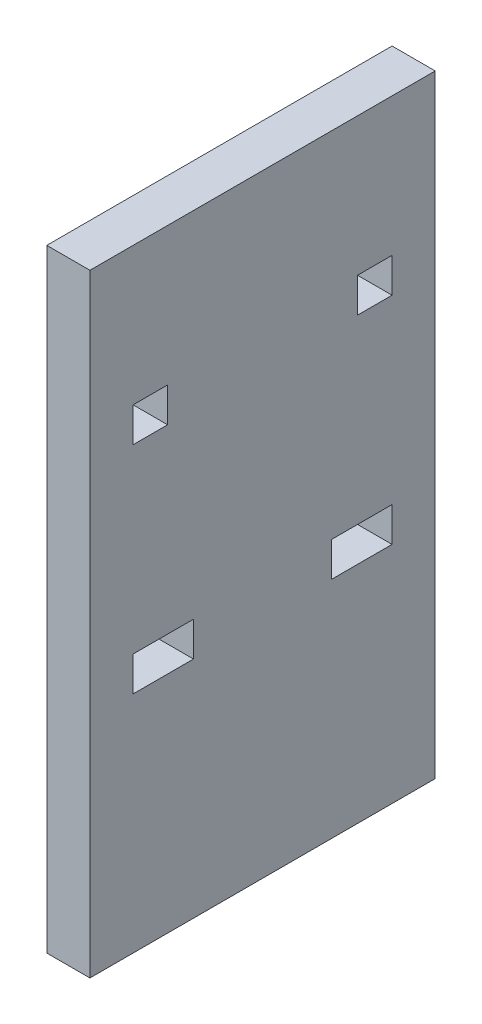
ISO-10303-21;
HEADER;
FILE_DESCRIPTION(('STEP AP214'),'2;1');
FILE_NAME('part.step','',(''),(''),'','','');
FILE_SCHEMA(('AUTOMOTIVE_DESIGN { 1 0 10303 214 1 1 1 1 }'));
ENDSEC;
DATA;
#1=APPLICATION_CONTEXT('core data for automotive mechanical design processes');
#2=APPLICATION_PROTOCOL_DEFINITION('international standard','automotive_design',2000,#1);
#3=PRODUCT_CONTEXT('',#1,'mechanical');
#4=PRODUCT('Part','Part','',(#3));
#5=PRODUCT_RELATED_PRODUCT_CATEGORY('part','',(#4));
#6=PRODUCT_DEFINITION_FORMATION('','',#4);
#7=PRODUCT_DEFINITION_CONTEXT('part definition',#1,'design');
#8=PRODUCT_DEFINITION('design','',#6,#7);
#9=PRODUCT_DEFINITION_SHAPE('','',#8);
#10=(LENGTH_UNIT() NAMED_UNIT(*) SI_UNIT(.MILLI.,.METRE.));
#11=(NAMED_UNIT(*) PLANE_ANGLE_UNIT() SI_UNIT($,.RADIAN.));
#12=(NAMED_UNIT(*) SI_UNIT($,.STERADIAN.) SOLID_ANGLE_UNIT());
#13=UNCERTAINTY_MEASURE_WITH_UNIT(LENGTH_MEASURE(1.E-05),#10,'distance_accuracy_value','');
#14=(GEOMETRIC_REPRESENTATION_CONTEXT(3) GLOBAL_UNCERTAINTY_ASSIGNED_CONTEXT((#13)) GLOBAL_UNIT_ASSIGNED_CONTEXT((#10,
#11,#12)) REPRESENTATION_CONTEXT('',''));
#15=CARTESIAN_POINT('',(0.,0.,0.));
#16=DIRECTION('',(0.,0.,1.));
#17=DIRECTION('',(1.,0.,0.));
#18=AXIS2_PLACEMENT_3D('',#15,#16,#17);
#19=CARTESIAN_POINT('',(2.5,71.,-20.));
#20=DIRECTION('',(-1.,0.,0.));
#21=DIRECTION('',(0.,0.,1.));
#22=AXIS2_PLACEMENT_3D('',#19,#20,#21);
#23=PLANE('',#22);
#24=DIRECTION('',(0.,0.,1.));
#25=VECTOR('',#24,1.);
#26=CARTESIAN_POINT('',(2.5,30.,-15.));
#27=LINE('',#26,#25);
#28=CARTESIAN_POINT('',(2.5,30.,-15.));
#29=VERTEX_POINT('',#28);
#30=CARTESIAN_POINT('',(2.5,30.,-8.));
#31=VERTEX_POINT('',#30);
#32=EDGE_CURVE('E390',#29,#31,#27,.T.);
#33=ORIENTED_EDGE('',*,*,#32,.F.);
#34=DIRECTION('',(0.,1.,0.));
#35=VECTOR('',#34,1.);
#36=CARTESIAN_POINT('',(2.5,30.,-15.));
#37=LINE('',#36,#35);
#38=CARTESIAN_POINT('',(2.5,26.,-15.));
#39=VERTEX_POINT('',#38);
#40=EDGE_CURVE('E53',#39,#29,#37,.T.);
#41=ORIENTED_EDGE('',*,*,#40,.F.);
#42=DIRECTION('',(0.,0.,-1.));
#43=VECTOR('',#42,1.);
#44=CARTESIAN_POINT('',(2.5,26.,-15.));
#45=LINE('',#44,#43);
#46=CARTESIAN_POINT('',(2.5,26.,-8.));
#47=VERTEX_POINT('',#46);
#48=EDGE_CURVE('E328',#47,#39,#45,.T.);
#49=ORIENTED_EDGE('',*,*,#48,.F.);
#50=DIRECTION('',(0.,-1.,0.));
#51=VECTOR('',#50,1.);
#52=CARTESIAN_POINT('',(2.5,30.,-8.));
#53=LINE('',#52,#51);
#54=EDGE_CURVE('E318',#31,#47,#53,.T.);
#55=ORIENTED_EDGE('',*,*,#54,.F.);
#56=EDGE_LOOP('',(#33,#41,#49,#55));
#57=FACE_BOUND('',#56,.T.);
#58=DIRECTION('',(0.,0.,1.));
#59=VECTOR('',#58,1.);
#60=CARTESIAN_POINT('',(2.5,55.,15.));
#61=LINE('',#60,#59);
#62=CARTESIAN_POINT('',(2.5,55.,11.));
#63=VERTEX_POINT('',#62);
#64=CARTESIAN_POINT('',(2.5,55.,15.));
#65=VERTEX_POINT('',#64);
#66=EDGE_CURVE('E331',#63,#65,#61,.T.);
#67=ORIENTED_EDGE('',*,*,#66,.F.);
#68=DIRECTION('',(0.,1.,0.));
#69=VECTOR('',#68,1.);
#70=CARTESIAN_POINT('',(2.5,55.,11.));
#71=LINE('',#70,#69);
#72=CARTESIAN_POINT('',(2.5,51.,11.));
#73=VERTEX_POINT('',#72);
#74=EDGE_CURVE('E61',#73,#63,#71,.T.);
#75=ORIENTED_EDGE('',*,*,#74,.F.);
#76=DIRECTION('',(0.,0.,-1.));
#77=VECTOR('',#76,1.);
#78=CARTESIAN_POINT('',(2.5,51.,15.));
#79=LINE('',#78,#77);
#80=CARTESIAN_POINT('',(2.5,51.,15.));
#81=VERTEX_POINT('',#80);
#82=EDGE_CURVE('E342',#81,#73,#79,.T.);
#83=ORIENTED_EDGE('',*,*,#82,.F.);
#84=DIRECTION('',(0.,-1.,0.));
#85=VECTOR('',#84,1.);
#86=CARTESIAN_POINT('',(2.5,55.,15.));
#87=LINE('',#86,#85);
#88=EDGE_CURVE('E347',#65,#81,#87,.T.);
#89=ORIENTED_EDGE('',*,*,#88,.F.);
#90=EDGE_LOOP('',(#67,#75,#83,#89));
#91=FACE_BOUND('',#90,.T.);
#92=DIRECTION('',(0.,0.,1.));
#93=VECTOR('',#92,1.);
#94=CARTESIAN_POINT('',(2.5,55.,-15.));
#95=LINE('',#94,#93);
#96=CARTESIAN_POINT('',(2.5,55.,-15.));
#97=VERTEX_POINT('',#96);
#98=CARTESIAN_POINT('',(2.5,55.,-11.));
#99=VERTEX_POINT('',#98);
#100=EDGE_CURVE('E193',#97,#99,#95,.T.);
#101=ORIENTED_EDGE('',*,*,#100,.F.);
#102=DIRECTION('',(0.,1.,0.));
#103=VECTOR('',#102,1.);
#104=CARTESIAN_POINT('',(2.5,55.,-15.));
#105=LINE('',#104,#103);
#106=CARTESIAN_POINT('',(2.5,51.,-15.));
#107=VERTEX_POINT('',#106);
#108=EDGE_CURVE('E198',#107,#97,#105,.T.);
#109=ORIENTED_EDGE('',*,*,#108,.F.);
#110=DIRECTION('',(0.,0.,-1.));
#111=VECTOR('',#110,1.);
#112=CARTESIAN_POINT('',(2.5,51.,-15.));
#113=LINE('',#112,#111);
#114=CARTESIAN_POINT('',(2.5,51.,-11.));
#115=VERTEX_POINT('',#114);
#116=EDGE_CURVE('E202',#115,#107,#113,.T.);
#117=ORIENTED_EDGE('',*,*,#116,.F.);
#118=DIRECTION('',(0.,-1.,0.));
#119=VECTOR('',#118,1.);
#120=CARTESIAN_POINT('',(2.5,55.,-11.));
#121=LINE('',#120,#119);
#122=EDGE_CURVE('E182',#99,#115,#121,.T.);
#123=ORIENTED_EDGE('',*,*,#122,.F.);
#124=EDGE_LOOP('',(#101,#109,#117,#123));
#125=FACE_BOUND('',#124,.T.);
#126=DIRECTION('',(0.,0.,1.));
#127=VECTOR('',#126,1.);
#128=CARTESIAN_POINT('',(2.5,30.,15.));
#129=LINE('',#128,#127);
#130=CARTESIAN_POINT('',(2.5,30.,8.));
#131=VERTEX_POINT('',#130);
#132=CARTESIAN_POINT('',(2.5,30.,15.));
#133=VERTEX_POINT('',#132);
#134=EDGE_CURVE('E218',#131,#133,#129,.T.);
#135=ORIENTED_EDGE('',*,*,#134,.F.);
#136=DIRECTION('',(0.,1.,0.));
#137=VECTOR('',#136,1.);
#138=CARTESIAN_POINT('',(2.5,30.,8.));
#139=LINE('',#138,#137);
#140=CARTESIAN_POINT('',(2.5,26.,8.));
#141=VERTEX_POINT('',#140);
#142=EDGE_CURVE('E223',#141,#131,#139,.T.);
#143=ORIENTED_EDGE('',*,*,#142,.F.);
#144=DIRECTION('',(0.,0.,-1.));
#145=VECTOR('',#144,1.);
#146=CARTESIAN_POINT('',(2.5,26.,15.));
#147=LINE('',#146,#145);
#148=CARTESIAN_POINT('',(2.5,26.,15.));
#149=VERTEX_POINT('',#148);
#150=EDGE_CURVE('E229',#149,#141,#147,.T.);
#151=ORIENTED_EDGE('',*,*,#150,.F.);
#152=DIRECTION('',(0.,-1.,0.));
#153=VECTOR('',#152,1.);
#154=CARTESIAN_POINT('',(2.5,30.,15.));
#155=LINE('',#154,#153);
#156=EDGE_CURVE('E222',#133,#149,#155,.T.);
#157=ORIENTED_EDGE('',*,*,#156,.F.);
#158=EDGE_LOOP('',(#135,#143,#151,#157));
#159=FACE_BOUND('',#158,.T.);
#160=DIRECTION('',(0.,0.,-1.));
#161=VECTOR('',#160,1.);
#162=CARTESIAN_POINT('',(2.5,0.,-20.));
#163=LINE('',#162,#161);
#164=CARTESIAN_POINT('',(2.5,0.,20.));
#165=VERTEX_POINT('',#164);
#166=CARTESIAN_POINT('',(2.5,0.,-20.));
#167=VERTEX_POINT('',#166);
#168=EDGE_CURVE('E237',#165,#167,#163,.T.);
#169=ORIENTED_EDGE('',*,*,#168,.T.);
#170=DIRECTION('',(0.,-1.,0.));
#171=VECTOR('',#170,1.);
#172=CARTESIAN_POINT('',(2.5,71.,-20.));
#173=LINE('',#172,#171);
#174=CARTESIAN_POINT('',(2.5,71.,-20.));
#175=VERTEX_POINT('',#174);
#176=EDGE_CURVE('E260',#175,#167,#173,.T.);
#177=ORIENTED_EDGE('',*,*,#176,.F.);
#178=DIRECTION('',(0.,0.,-1.));
#179=VECTOR('',#178,1.);
#180=CARTESIAN_POINT('',(2.5,71.,-20.));
#181=LINE('',#180,#179);
#182=CARTESIAN_POINT('',(2.5,71.,20.));
#183=VERTEX_POINT('',#182);
#184=EDGE_CURVE('E250',#183,#175,#181,.T.);
#185=ORIENTED_EDGE('',*,*,#184,.F.);
#186=DIRECTION('',(0.,-1.,0.));
#187=VECTOR('',#186,1.);
#188=CARTESIAN_POINT('',(2.5,71.,20.));
#189=LINE('',#188,#187);
#190=EDGE_CURVE('E251',#183,#165,#189,.T.);
#191=ORIENTED_EDGE('',*,*,#190,.T.);
#192=EDGE_LOOP('',(#169,#177,#185,#191));
#193=FACE_BOUND('',#192,.T.);
#194=ADVANCED_FACE('F39',(#57,#91,#125,#159,#193),#23,.F.);
#195=CARTESIAN_POINT('',(-2.5,71.,-20.));
#196=DIRECTION('',(0.,0.,1.));
#197=DIRECTION('',(1.,0.,0.));
#198=AXIS2_PLACEMENT_3D('',#195,#196,#197);
#199=PLANE('',#198);
#200=DIRECTION('',(-1.,0.,0.));
#201=VECTOR('',#200,1.);
#202=CARTESIAN_POINT('',(-2.5,0.,-20.));
#203=LINE('',#202,#201);
#204=CARTESIAN_POINT('',(-2.5,0.,-20.));
#205=VERTEX_POINT('',#204);
#206=EDGE_CURVE('E242',#167,#205,#203,.T.);
#207=ORIENTED_EDGE('',*,*,#206,.T.);
#208=DIRECTION('',(0.,-1.,0.));
#209=VECTOR('',#208,1.);
#210=CARTESIAN_POINT('',(-2.5,71.,-20.));
#211=LINE('',#210,#209);
#212=CARTESIAN_POINT('',(-2.5,71.,-20.));
#213=VERTEX_POINT('',#212);
#214=EDGE_CURVE('E258',#213,#205,#211,.T.);
#215=ORIENTED_EDGE('',*,*,#214,.F.);
#216=DIRECTION('',(-1.,0.,0.));
#217=VECTOR('',#216,1.);
#218=CARTESIAN_POINT('',(-2.5,71.,-20.));
#219=LINE('',#218,#217);
#220=EDGE_CURVE('E431',#175,#213,#219,.T.);
#221=ORIENTED_EDGE('',*,*,#220,.F.);
#222=ORIENTED_EDGE('',*,*,#176,.T.);
#223=EDGE_LOOP('',(#207,#215,#221,#222));
#224=FACE_BOUND('',#223,.T.);
#225=ADVANCED_FACE('F382',(#224),#199,.F.);
#226=CARTESIAN_POINT('',(-2.5,71.,-20.));
#227=DIRECTION('',(1.,0.,0.));
#228=DIRECTION('',(0.,0.,-1.));
#229=AXIS2_PLACEMENT_3D('',#226,#227,#228);
#230=PLANE('',#229);
#231=DIRECTION('',(0.,0.,-1.));
#232=VECTOR('',#231,1.);
#233=CARTESIAN_POINT('',(-2.5,26.,-20.));
#234=LINE('',#233,#232);
#235=CARTESIAN_POINT('',(-2.5,26.,-7.99999999999999));
#236=VERTEX_POINT('',#235);
#237=CARTESIAN_POINT('',(-2.5,26.,-15.));
#238=VERTEX_POINT('',#237);
#239=EDGE_CURVE('E46',#236,#238,#234,.T.);
#240=ORIENTED_EDGE('',*,*,#239,.T.);
#241=DIRECTION('',(0.,1.,0.));
#242=VECTOR('',#241,1.);
#243=CARTESIAN_POINT('',(-2.5,71.,-15.));
#244=LINE('',#243,#242);
#245=CARTESIAN_POINT('',(-2.5,30.,-15.));
#246=VERTEX_POINT('',#245);
#247=EDGE_CURVE('E12',#238,#246,#244,.T.);
#248=ORIENTED_EDGE('',*,*,#247,.T.);
#249=DIRECTION('',(0.,0.,1.));
#250=VECTOR('',#249,1.);
#251=CARTESIAN_POINT('',(-2.5,30.,-20.));
#252=LINE('',#251,#250);
#253=CARTESIAN_POINT('',(-2.5,30.,-7.99999999999999));
#254=VERTEX_POINT('',#253);
#255=EDGE_CURVE('E297',#246,#254,#252,.T.);
#256=ORIENTED_EDGE('',*,*,#255,.T.);
#257=DIRECTION('',(0.,-1.,0.));
#258=VECTOR('',#257,1.);
#259=CARTESIAN_POINT('',(-2.5,71.,-7.99999999999999));
#260=LINE('',#259,#258);
#261=EDGE_CURVE('E300',#254,#236,#260,.T.);
#262=ORIENTED_EDGE('',*,*,#261,.T.);
#263=EDGE_LOOP('',(#240,#248,#256,#262));
#264=FACE_BOUND('',#263,.T.);
#265=DIRECTION('',(0.,0.,-1.));
#266=VECTOR('',#265,1.);
#267=CARTESIAN_POINT('',(-2.5,51.,-20.));
#268=LINE('',#267,#266);
#269=CARTESIAN_POINT('',(-2.5,51.,15.));
#270=VERTEX_POINT('',#269);
#271=CARTESIAN_POINT('',(-2.5,51.,11.));
#272=VERTEX_POINT('',#271);
#273=EDGE_CURVE('E291',#270,#272,#268,.T.);
#274=ORIENTED_EDGE('',*,*,#273,.T.);
#275=DIRECTION('',(0.,1.,0.));
#276=VECTOR('',#275,1.);
#277=CARTESIAN_POINT('',(-2.5,71.,11.));
#278=LINE('',#277,#276);
#279=CARTESIAN_POINT('',(-2.5,55.,11.));
#280=VERTEX_POINT('',#279);
#281=EDGE_CURVE('E294',#272,#280,#278,.T.);
#282=ORIENTED_EDGE('',*,*,#281,.T.);
#283=DIRECTION('',(0.,0.,1.));
#284=VECTOR('',#283,1.);
#285=CARTESIAN_POINT('',(-2.5,55.,-20.));
#286=LINE('',#285,#284);
#287=CARTESIAN_POINT('',(-2.5,55.,15.));
#288=VERTEX_POINT('',#287);
#289=EDGE_CURVE('E285',#280,#288,#286,.T.);
#290=ORIENTED_EDGE('',*,*,#289,.T.);
#291=DIRECTION('',(0.,-1.,0.));
#292=VECTOR('',#291,1.);
#293=CARTESIAN_POINT('',(-2.5,71.,15.));
#294=LINE('',#293,#292);
#295=EDGE_CURVE('E288',#288,#270,#294,.T.);
#296=ORIENTED_EDGE('',*,*,#295,.T.);
#297=EDGE_LOOP('',(#274,#282,#290,#296));
#298=FACE_BOUND('',#297,.T.);
#299=DIRECTION('',(0.,0.,-1.));
#300=VECTOR('',#299,1.);
#301=CARTESIAN_POINT('',(-2.5,51.,-20.));
#302=LINE('',#301,#300);
#303=CARTESIAN_POINT('',(-2.5,51.,-11.));
#304=VERTEX_POINT('',#303);
#305=CARTESIAN_POINT('',(-2.5,51.,-15.));
#306=VERTEX_POINT('',#305);
#307=EDGE_CURVE('E279',#304,#306,#302,.T.);
#308=ORIENTED_EDGE('',*,*,#307,.T.);
#309=DIRECTION('',(0.,1.,0.));
#310=VECTOR('',#309,1.);
#311=CARTESIAN_POINT('',(-2.5,71.,-15.));
#312=LINE('',#311,#310);
#313=CARTESIAN_POINT('',(-2.5,55.,-15.));
#314=VERTEX_POINT('',#313);
#315=EDGE_CURVE('E282',#306,#314,#312,.T.);
#316=ORIENTED_EDGE('',*,*,#315,.T.);
#317=DIRECTION('',(0.,0.,1.));
#318=VECTOR('',#317,1.);
#319=CARTESIAN_POINT('',(-2.5,55.,-20.));
#320=LINE('',#319,#318);
#321=CARTESIAN_POINT('',(-2.5,55.,-11.));
#322=VERTEX_POINT('',#321);
#323=EDGE_CURVE('E276',#314,#322,#320,.T.);
#324=ORIENTED_EDGE('',*,*,#323,.T.);
#325=DIRECTION('',(0.,-1.,0.));
#326=VECTOR('',#325,1.);
#327=CARTESIAN_POINT('',(-2.5,71.,-11.));
#328=LINE('',#327,#326);
#329=EDGE_CURVE('E185',#322,#304,#328,.T.);
#330=ORIENTED_EDGE('',*,*,#329,.T.);
#331=EDGE_LOOP('',(#308,#316,#324,#330));
#332=FACE_BOUND('',#331,.T.);
#333=DIRECTION('',(0.,0.,-1.));
#334=VECTOR('',#333,1.);
#335=CARTESIAN_POINT('',(-2.5,26.,-20.));
#336=LINE('',#335,#334);
#337=CARTESIAN_POINT('',(-2.5,26.,15.));
#338=VERTEX_POINT('',#337);
#339=CARTESIAN_POINT('',(-2.5,26.,8.));
#340=VERTEX_POINT('',#339);
#341=EDGE_CURVE('E270',#338,#340,#336,.T.);
#342=ORIENTED_EDGE('',*,*,#341,.T.);
#343=DIRECTION('',(0.,1.,0.));
#344=VECTOR('',#343,1.);
#345=CARTESIAN_POINT('',(-2.5,71.,8.));
#346=LINE('',#345,#344);
#347=CARTESIAN_POINT('',(-2.5,30.,8.));
#348=VERTEX_POINT('',#347);
#349=EDGE_CURVE('E273',#340,#348,#346,.T.);
#350=ORIENTED_EDGE('',*,*,#349,.T.);
#351=DIRECTION('',(0.,0.,1.));
#352=VECTOR('',#351,1.);
#353=CARTESIAN_POINT('',(-2.5,30.,-20.));
#354=LINE('',#353,#352);
#355=CARTESIAN_POINT('',(-2.5,30.,15.));
#356=VERTEX_POINT('',#355);
#357=EDGE_CURVE('E264',#348,#356,#354,.T.);
#358=ORIENTED_EDGE('',*,*,#357,.T.);
#359=DIRECTION('',(0.,-1.,0.));
#360=VECTOR('',#359,1.);
#361=CARTESIAN_POINT('',(-2.5,71.,15.));
#362=LINE('',#361,#360);
#363=EDGE_CURVE('E267',#356,#338,#362,.T.);
#364=ORIENTED_EDGE('',*,*,#363,.T.);
#365=EDGE_LOOP('',(#342,#350,#358,#364));
#366=FACE_BOUND('',#365,.T.);
#367=DIRECTION('',(0.,0.,1.));
#368=VECTOR('',#367,1.);
#369=CARTESIAN_POINT('',(-2.5,0.,-20.));
#370=LINE('',#369,#368);
#371=CARTESIAN_POINT('',(-2.5,0.,20.));
#372=VERTEX_POINT('',#371);
#373=EDGE_CURVE('E247',#205,#372,#370,.T.);
#374=ORIENTED_EDGE('',*,*,#373,.T.);
#375=DIRECTION('',(0.,-1.,0.));
#376=VECTOR('',#375,1.);
#377=CARTESIAN_POINT('',(-2.5,71.,20.));
#378=LINE('',#377,#376);
#379=CARTESIAN_POINT('',(-2.5,71.,20.));
#380=VERTEX_POINT('',#379);
#381=EDGE_CURVE('E255',#380,#372,#378,.T.);
#382=ORIENTED_EDGE('',*,*,#381,.F.);
#383=DIRECTION('',(0.,0.,1.));
#384=VECTOR('',#383,1.);
#385=CARTESIAN_POINT('',(-2.5,71.,-20.));
#386=LINE('',#385,#384);
#387=EDGE_CURVE('E433',#213,#380,#386,.T.);
#388=ORIENTED_EDGE('',*,*,#387,.F.);
#389=ORIENTED_EDGE('',*,*,#214,.T.);
#390=EDGE_LOOP('',(#374,#382,#388,#389));
#391=FACE_BOUND('',#390,.T.);
#392=ADVANCED_FACE('F304',(#264,#298,#332,#366,#391),#230,.F.);
#393=CARTESIAN_POINT('',(-2.5,71.,20.));
#394=DIRECTION('',(0.,0.,-1.));
#395=DIRECTION('',(-1.,0.,0.));
#396=AXIS2_PLACEMENT_3D('',#393,#394,#395);
#397=PLANE('',#396);
#398=DIRECTION('',(1.,0.,0.));
#399=VECTOR('',#398,1.);
#400=CARTESIAN_POINT('',(-2.5,0.,20.));
#401=LINE('',#400,#399);
#402=EDGE_CURVE('E249',#372,#165,#401,.T.);
#403=ORIENTED_EDGE('',*,*,#402,.T.);
#404=ORIENTED_EDGE('',*,*,#190,.F.);
#405=DIRECTION('',(1.,0.,0.));
#406=VECTOR('',#405,1.);
#407=CARTESIAN_POINT('',(-2.5,71.,20.));
#408=LINE('',#407,#406);
#409=EDGE_CURVE('E244',#380,#183,#408,.T.);
#410=ORIENTED_EDGE('',*,*,#409,.F.);
#411=ORIENTED_EDGE('',*,*,#381,.T.);
#412=EDGE_LOOP('',(#403,#404,#410,#411));
#413=FACE_BOUND('',#412,.T.);
#414=ADVANCED_FACE('F412',(#413),#397,.F.);
#415=CARTESIAN_POINT('',(0.,71.,0.));
#416=DIRECTION('',(0.,1.,0.));
#417=DIRECTION('',(0.,0.,1.));
#418=AXIS2_PLACEMENT_3D('',#415,#416,#417);
#419=PLANE('',#418);
#420=ORIENTED_EDGE('',*,*,#184,.T.);
#421=ORIENTED_EDGE('',*,*,#220,.T.);
#422=ORIENTED_EDGE('',*,*,#387,.T.);
#423=ORIENTED_EDGE('',*,*,#409,.T.);
#424=EDGE_LOOP('',(#420,#421,#422,#423));
#425=FACE_BOUND('',#424,.T.);
#426=ADVANCED_FACE('F439',(#425),#419,.T.);
#427=CARTESIAN_POINT('',(0.,0.,0.));
#428=DIRECTION('',(0.,1.,0.));
#429=DIRECTION('',(0.,0.,1.));
#430=AXIS2_PLACEMENT_3D('',#427,#428,#429);
#431=PLANE('',#430);
#432=ORIENTED_EDGE('',*,*,#168,.F.);
#433=ORIENTED_EDGE('',*,*,#402,.F.);
#434=ORIENTED_EDGE('',*,*,#373,.F.);
#435=ORIENTED_EDGE('',*,*,#206,.F.);
#436=EDGE_LOOP('',(#432,#433,#434,#435));
#437=FACE_BOUND('',#436,.T.);
#438=ADVANCED_FACE('F425',(#437),#431,.F.);
#439=CARTESIAN_POINT('',(-7.5,30.,8.));
#440=DIRECTION('',(0.,0.,-1.));
#441=DIRECTION('',(-1.,0.,0.));
#442=AXIS2_PLACEMENT_3D('',#439,#440,#441);
#443=PLANE('',#442);
#444=DIRECTION('',(1.,0.,0.));
#445=VECTOR('',#444,1.);
#446=CARTESIAN_POINT('',(-7.5,26.,8.));
#447=LINE('',#446,#445);
#448=EDGE_CURVE('E243',#340,#141,#447,.T.);
#449=ORIENTED_EDGE('',*,*,#448,.T.);
#450=ORIENTED_EDGE('',*,*,#142,.T.);
#451=DIRECTION('',(1.,0.,0.));
#452=VECTOR('',#451,1.);
#453=CARTESIAN_POINT('',(-7.5,30.,8.));
#454=LINE('',#453,#452);
#455=EDGE_CURVE('E437',#348,#131,#454,.T.);
#456=ORIENTED_EDGE('',*,*,#455,.F.);
#457=ORIENTED_EDGE('',*,*,#349,.F.);
#458=EDGE_LOOP('',(#449,#450,#456,#457));
#459=FACE_BOUND('',#458,.T.);
#460=ADVANCED_FACE('F446',(#459),#443,.F.);
#461=CARTESIAN_POINT('',(-7.5,26.,15.));
#462=DIRECTION('',(0.,-1.,0.));
#463=DIRECTION('',(0.,0.,-1.));
#464=AXIS2_PLACEMENT_3D('',#461,#462,#463);
#465=PLANE('',#464);
#466=DIRECTION('',(1.,0.,0.));
#467=VECTOR('',#466,1.);
#468=CARTESIAN_POINT('',(-7.5,26.,15.));
#469=LINE('',#468,#467);
#470=EDGE_CURVE('E467',#338,#149,#469,.T.);
#471=ORIENTED_EDGE('',*,*,#470,.T.);
#472=ORIENTED_EDGE('',*,*,#150,.T.);
#473=ORIENTED_EDGE('',*,*,#448,.F.);
#474=ORIENTED_EDGE('',*,*,#341,.F.);
#475=EDGE_LOOP('',(#471,#472,#473,#474));
#476=FACE_BOUND('',#475,.T.);
#477=ADVANCED_FACE('F452',(#476),#465,.F.);
#478=CARTESIAN_POINT('',(-7.5,30.,15.));
#479=DIRECTION('',(0.,0.,1.));
#480=DIRECTION('',(1.,0.,0.));
#481=AXIS2_PLACEMENT_3D('',#478,#479,#480);
#482=PLANE('',#481);
#483=DIRECTION('',(1.,0.,0.));
#484=VECTOR('',#483,1.);
#485=CARTESIAN_POINT('',(-7.5,30.,15.));
#486=LINE('',#485,#484);
#487=EDGE_CURVE('E472',#356,#133,#486,.T.);
#488=ORIENTED_EDGE('',*,*,#487,.T.);
#489=ORIENTED_EDGE('',*,*,#156,.T.);
#490=ORIENTED_EDGE('',*,*,#470,.F.);
#491=ORIENTED_EDGE('',*,*,#363,.F.);
#492=EDGE_LOOP('',(#488,#489,#490,#491));
#493=FACE_BOUND('',#492,.T.);
#494=ADVANCED_FACE('F457',(#493),#482,.F.);
#495=CARTESIAN_POINT('',(-7.5,30.,15.));
#496=DIRECTION('',(0.,1.,0.));
#497=DIRECTION('',(0.,0.,1.));
#498=AXIS2_PLACEMENT_3D('',#495,#496,#497);
#499=PLANE('',#498);
#500=ORIENTED_EDGE('',*,*,#455,.T.);
#501=ORIENTED_EDGE('',*,*,#134,.T.);
#502=ORIENTED_EDGE('',*,*,#487,.F.);
#503=ORIENTED_EDGE('',*,*,#357,.F.);
#504=EDGE_LOOP('',(#500,#501,#502,#503));
#505=FACE_BOUND('',#504,.T.);
#506=ADVANCED_FACE('F454',(#505),#499,.F.);
#507=CARTESIAN_POINT('',(-7.5,55.,-15.));
#508=DIRECTION('',(0.,0.,-1.));
#509=DIRECTION('',(-1.,0.,0.));
#510=AXIS2_PLACEMENT_3D('',#507,#508,#509);
#511=PLANE('',#510);
#512=DIRECTION('',(1.,0.,0.));
#513=VECTOR('',#512,1.);
#514=CARTESIAN_POINT('',(-7.5,51.,-15.));
#515=LINE('',#514,#513);
#516=EDGE_CURVE('E332',#306,#107,#515,.T.);
#517=ORIENTED_EDGE('',*,*,#516,.T.);
#518=ORIENTED_EDGE('',*,*,#108,.T.);
#519=DIRECTION('',(1.,0.,0.));
#520=VECTOR('',#519,1.);
#521=CARTESIAN_POINT('',(-7.5,55.,-15.));
#522=LINE('',#521,#520);
#523=EDGE_CURVE('E189',#314,#97,#522,.T.);
#524=ORIENTED_EDGE('',*,*,#523,.F.);
#525=ORIENTED_EDGE('',*,*,#315,.F.);
#526=EDGE_LOOP('',(#517,#518,#524,#525));
#527=FACE_BOUND('',#526,.T.);
#528=ADVANCED_FACE('F406',(#527),#511,.F.);
#529=CARTESIAN_POINT('',(-7.5,51.,-15.));
#530=DIRECTION('',(0.,-1.,0.));
#531=DIRECTION('',(0.,0.,-1.));
#532=AXIS2_PLACEMENT_3D('',#529,#530,#531);
#533=PLANE('',#532);
#534=DIRECTION('',(1.,0.,0.));
#535=VECTOR('',#534,1.);
#536=CARTESIAN_POINT('',(-7.5,51.,-11.));
#537=LINE('',#536,#535);
#538=EDGE_CURVE('E188',#304,#115,#537,.T.);
#539=ORIENTED_EDGE('',*,*,#538,.T.);
#540=ORIENTED_EDGE('',*,*,#116,.T.);
#541=ORIENTED_EDGE('',*,*,#516,.F.);
#542=ORIENTED_EDGE('',*,*,#307,.F.);
#543=EDGE_LOOP('',(#539,#540,#541,#542));
#544=FACE_BOUND('',#543,.T.);
#545=ADVANCED_FACE('F408',(#544),#533,.F.);
#546=CARTESIAN_POINT('',(-7.5,55.,-11.));
#547=DIRECTION('',(0.,0.,1.));
#548=DIRECTION('',(1.,0.,0.));
#549=AXIS2_PLACEMENT_3D('',#546,#547,#548);
#550=PLANE('',#549);
#551=DIRECTION('',(1.,0.,0.));
#552=VECTOR('',#551,1.);
#553=CARTESIAN_POINT('',(-7.5,55.,-11.));
#554=LINE('',#553,#552);
#555=EDGE_CURVE('E177',#322,#99,#554,.T.);
#556=ORIENTED_EDGE('',*,*,#555,.T.);
#557=ORIENTED_EDGE('',*,*,#122,.T.);
#558=ORIENTED_EDGE('',*,*,#538,.F.);
#559=ORIENTED_EDGE('',*,*,#329,.F.);
#560=EDGE_LOOP('',(#556,#557,#558,#559));
#561=FACE_BOUND('',#560,.T.);
#562=ADVANCED_FACE('F179',(#561),#550,.F.);
#563=CARTESIAN_POINT('',(-7.5,55.,-15.));
#564=DIRECTION('',(0.,1.,0.));
#565=DIRECTION('',(0.,0.,1.));
#566=AXIS2_PLACEMENT_3D('',#563,#564,#565);
#567=PLANE('',#566);
#568=ORIENTED_EDGE('',*,*,#523,.T.);
#569=ORIENTED_EDGE('',*,*,#100,.T.);
#570=ORIENTED_EDGE('',*,*,#555,.F.);
#571=ORIENTED_EDGE('',*,*,#323,.F.);
#572=EDGE_LOOP('',(#568,#569,#570,#571));
#573=FACE_BOUND('',#572,.T.);
#574=ADVANCED_FACE('F194',(#573),#567,.F.);
#575=CARTESIAN_POINT('',(-7.5,55.,11.));
#576=DIRECTION('',(0.,0.,-1.));
#577=DIRECTION('',(-1.,0.,0.));
#578=AXIS2_PLACEMENT_3D('',#575,#576,#577);
#579=PLANE('',#578);
#580=DIRECTION('',(1.,0.,0.));
#581=VECTOR('',#580,1.);
#582=CARTESIAN_POINT('',(-7.5,51.,11.));
#583=LINE('',#582,#581);
#584=EDGE_CURVE('E349',#272,#73,#583,.T.);
#585=ORIENTED_EDGE('',*,*,#584,.T.);
#586=ORIENTED_EDGE('',*,*,#74,.T.);
#587=DIRECTION('',(1.,0.,0.));
#588=VECTOR('',#587,1.);
#589=CARTESIAN_POINT('',(-7.5,55.,11.));
#590=LINE('',#589,#588);
#591=EDGE_CURVE('E346',#280,#63,#590,.T.);
#592=ORIENTED_EDGE('',*,*,#591,.F.);
#593=ORIENTED_EDGE('',*,*,#281,.F.);
#594=EDGE_LOOP('',(#585,#586,#592,#593));
#595=FACE_BOUND('',#594,.T.);
#596=ADVANCED_FACE('F370',(#595),#579,.F.);
#597=CARTESIAN_POINT('',(-7.5,51.,15.));
#598=DIRECTION('',(0.,-1.,0.));
#599=DIRECTION('',(0.,0.,-1.));
#600=AXIS2_PLACEMENT_3D('',#597,#598,#599);
#601=PLANE('',#600);
#602=DIRECTION('',(1.,0.,0.));
#603=VECTOR('',#602,1.);
#604=CARTESIAN_POINT('',(-7.5,51.,15.));
#605=LINE('',#604,#603);
#606=EDGE_CURVE('E351',#270,#81,#605,.T.);
#607=ORIENTED_EDGE('',*,*,#606,.T.);
#608=ORIENTED_EDGE('',*,*,#82,.T.);
#609=ORIENTED_EDGE('',*,*,#584,.F.);
#610=ORIENTED_EDGE('',*,*,#273,.F.);
#611=EDGE_LOOP('',(#607,#608,#609,#610));
#612=FACE_BOUND('',#611,.T.);
#613=ADVANCED_FACE('F368',(#612),#601,.F.);
#614=CARTESIAN_POINT('',(-7.5,55.,15.));
#615=DIRECTION('',(0.,0.,1.));
#616=DIRECTION('',(1.,0.,0.));
#617=AXIS2_PLACEMENT_3D('',#614,#615,#616);
#618=PLANE('',#617);
#619=DIRECTION('',(1.,0.,0.));
#620=VECTOR('',#619,1.);
#621=CARTESIAN_POINT('',(-7.5,55.,15.));
#622=LINE('',#621,#620);
#623=EDGE_CURVE('E353',#288,#65,#622,.T.);
#624=ORIENTED_EDGE('',*,*,#623,.T.);
#625=ORIENTED_EDGE('',*,*,#88,.T.);
#626=ORIENTED_EDGE('',*,*,#606,.F.);
#627=ORIENTED_EDGE('',*,*,#295,.F.);
#628=EDGE_LOOP('',(#624,#625,#626,#627));
#629=FACE_BOUND('',#628,.T.);
#630=ADVANCED_FACE('F364',(#629),#618,.F.);
#631=CARTESIAN_POINT('',(-7.5,55.,15.));
#632=DIRECTION('',(0.,1.,0.));
#633=DIRECTION('',(0.,0.,1.));
#634=AXIS2_PLACEMENT_3D('',#631,#632,#633);
#635=PLANE('',#634);
#636=ORIENTED_EDGE('',*,*,#591,.T.);
#637=ORIENTED_EDGE('',*,*,#66,.T.);
#638=ORIENTED_EDGE('',*,*,#623,.F.);
#639=ORIENTED_EDGE('',*,*,#289,.F.);
#640=EDGE_LOOP('',(#636,#637,#638,#639));
#641=FACE_BOUND('',#640,.T.);
#642=ADVANCED_FACE('F357',(#641),#635,.F.);
#643=CARTESIAN_POINT('',(-7.5,30.,-15.));
#644=DIRECTION('',(0.,0.,-1.));
#645=DIRECTION('',(-1.,0.,0.));
#646=AXIS2_PLACEMENT_3D('',#643,#644,#645);
#647=PLANE('',#646);
#648=DIRECTION('',(1.,0.,0.));
#649=VECTOR('',#648,1.);
#650=CARTESIAN_POINT('',(-7.5,26.,-15.));
#651=LINE('',#650,#649);
#652=EDGE_CURVE('E314',#238,#39,#651,.T.);
#653=ORIENTED_EDGE('',*,*,#652,.T.);
#654=ORIENTED_EDGE('',*,*,#40,.T.);
#655=DIRECTION('',(1.,0.,0.));
#656=VECTOR('',#655,1.);
#657=CARTESIAN_POINT('',(-7.5,30.,-15.));
#658=LINE('',#657,#656);
#659=EDGE_CURVE('E323',#246,#29,#658,.T.);
#660=ORIENTED_EDGE('',*,*,#659,.F.);
#661=ORIENTED_EDGE('',*,*,#247,.F.);
#662=EDGE_LOOP('',(#653,#654,#660,#661));
#663=FACE_BOUND('',#662,.T.);
#664=ADVANCED_FACE('F537',(#663),#647,.F.);
#665=CARTESIAN_POINT('',(-7.5,26.,-15.));
#666=DIRECTION('',(0.,-1.,0.));
#667=DIRECTION('',(0.,0.,-1.));
#668=AXIS2_PLACEMENT_3D('',#665,#666,#667);
#669=PLANE('',#668);
#670=DIRECTION('',(1.,0.,0.));
#671=VECTOR('',#670,1.);
#672=CARTESIAN_POINT('',(-7.5,26.,-7.99999999999999));
#673=LINE('',#672,#671);
#674=EDGE_CURVE('E312',#236,#47,#673,.T.);
#675=ORIENTED_EDGE('',*,*,#674,.T.);
#676=ORIENTED_EDGE('',*,*,#48,.T.);
#677=ORIENTED_EDGE('',*,*,#652,.F.);
#678=ORIENTED_EDGE('',*,*,#239,.F.);
#679=EDGE_LOOP('',(#675,#676,#677,#678));
#680=FACE_BOUND('',#679,.T.);
#681=ADVANCED_FACE('F310',(#680),#669,.F.);
#682=CARTESIAN_POINT('',(-7.5,30.,-7.99999999999999));
#683=DIRECTION('',(0.,0.,1.));
#684=DIRECTION('',(1.,0.,0.));
#685=AXIS2_PLACEMENT_3D('',#682,#683,#684);
#686=PLANE('',#685);
#687=DIRECTION('',(1.,0.,0.));
#688=VECTOR('',#687,1.);
#689=CARTESIAN_POINT('',(-7.5,30.,-7.99999999999999));
#690=LINE('',#689,#688);
#691=EDGE_CURVE('E320',#254,#31,#690,.T.);
#692=ORIENTED_EDGE('',*,*,#691,.T.);
#693=ORIENTED_EDGE('',*,*,#54,.T.);
#694=ORIENTED_EDGE('',*,*,#674,.F.);
#695=ORIENTED_EDGE('',*,*,#261,.F.);
#696=EDGE_LOOP('',(#692,#693,#694,#695));
#697=FACE_BOUND('',#696,.T.);
#698=ADVANCED_FACE('F316',(#697),#686,.F.);
#699=CARTESIAN_POINT('',(-7.5,30.,-15.));
#700=DIRECTION('',(0.,1.,0.));
#701=DIRECTION('',(0.,0.,1.));
#702=AXIS2_PLACEMENT_3D('',#699,#700,#701);
#703=PLANE('',#702);
#704=ORIENTED_EDGE('',*,*,#659,.T.);
#705=ORIENTED_EDGE('',*,*,#32,.T.);
#706=ORIENTED_EDGE('',*,*,#691,.F.);
#707=ORIENTED_EDGE('',*,*,#255,.F.);
#708=EDGE_LOOP('',(#704,#705,#706,#707));
#709=FACE_BOUND('',#708,.T.);
#710=ADVANCED_FACE('F561',(#709),#703,.F.);
#711=CLOSED_SHELL('',(#194,#225,#392,#414,#426,#438,#460,#477,#494,#506,#528,#545,#562,#574,
#596,#613,#630,#642,#664,#681,#698,#710));
#712=MANIFOLD_SOLID_BREP('B2',#711);
#713=ADVANCED_BREP_SHAPE_REPRESENTATION('',(#18,#712),#14);
#714=SHAPE_DEFINITION_REPRESENTATION(#9,#713);
ENDSEC;
END-ISO-10303-21;
